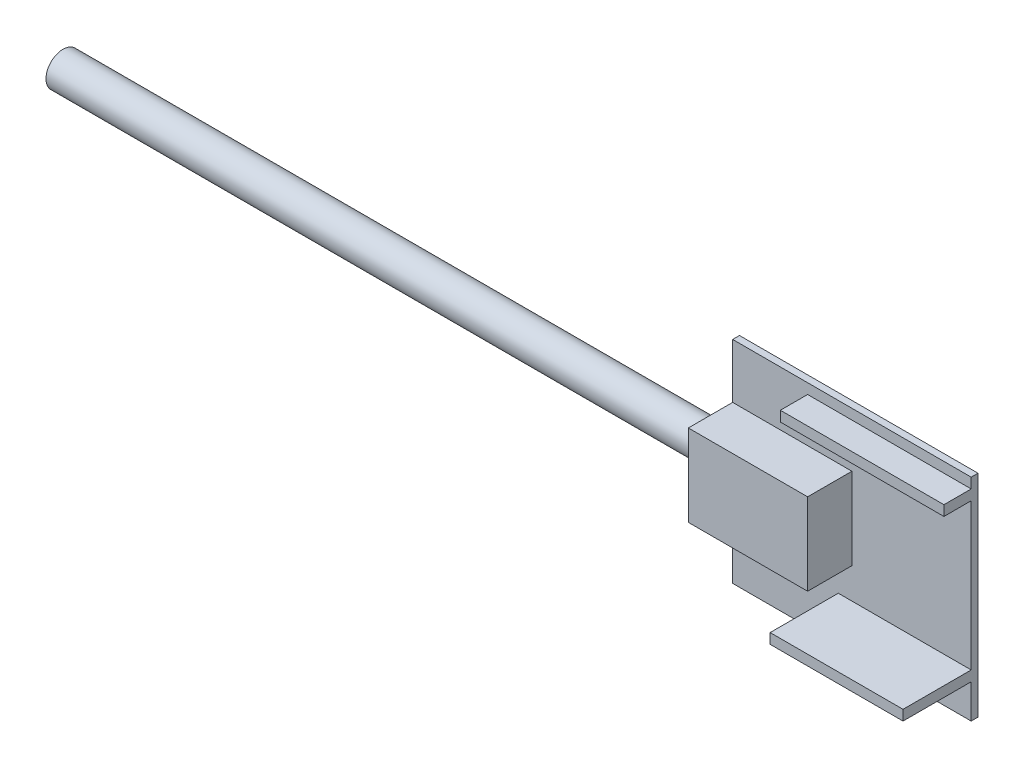
ISO-10303-21;
HEADER;
FILE_DESCRIPTION(('STEP AP214'),'2;1');
FILE_NAME('part.step','',(''),(''),'','','');
FILE_SCHEMA(('AUTOMOTIVE_DESIGN { 1 0 10303 214 1 1 1 1 }'));
ENDSEC;
DATA;
#1=APPLICATION_CONTEXT('core data for automotive mechanical design processes');
#2=APPLICATION_PROTOCOL_DEFINITION('international standard','automotive_design',2000,#1);
#3=PRODUCT_CONTEXT('',#1,'mechanical');
#4=PRODUCT('Part','Part','',(#3));
#5=PRODUCT_RELATED_PRODUCT_CATEGORY('part','',(#4));
#6=PRODUCT_DEFINITION_FORMATION('','',#4);
#7=PRODUCT_DEFINITION_CONTEXT('part definition',#1,'design');
#8=PRODUCT_DEFINITION('design','',#6,#7);
#9=PRODUCT_DEFINITION_SHAPE('','',#8);
#10=(LENGTH_UNIT() NAMED_UNIT(*) SI_UNIT(.MILLI.,.METRE.));
#11=(NAMED_UNIT(*) PLANE_ANGLE_UNIT() SI_UNIT($,.RADIAN.));
#12=(NAMED_UNIT(*) SI_UNIT($,.STERADIAN.) SOLID_ANGLE_UNIT());
#13=UNCERTAINTY_MEASURE_WITH_UNIT(LENGTH_MEASURE(1.E-05),#10,'distance_accuracy_value','');
#14=(GEOMETRIC_REPRESENTATION_CONTEXT(3) GLOBAL_UNCERTAINTY_ASSIGNED_CONTEXT((#13)) GLOBAL_UNIT_ASSIGNED_CONTEXT((#10,
#11,#12)) REPRESENTATION_CONTEXT('',''));
#15=CARTESIAN_POINT('',(0.,0.,0.));
#16=DIRECTION('',(0.,0.,1.));
#17=DIRECTION('',(1.,0.,0.));
#18=AXIS2_PLACEMENT_3D('',#15,#16,#17);
#19=CARTESIAN_POINT('',(0.,0.,2.));
#20=DIRECTION('',(0.,0.,1.));
#21=DIRECTION('',(1.,0.,0.));
#22=AXIS2_PLACEMENT_3D('',#19,#20,#21);
#23=PLANE('',#22);
#24=DIRECTION('',(0.,1.,0.));
#25=VECTOR('',#24,1.);
#26=CARTESIAN_POINT('',(35.,31.,2.));
#27=LINE('',#26,#25);
#28=CARTESIAN_POINT('',(35.,-18.,2.));
#29=VERTEX_POINT('',#28);
#30=CARTESIAN_POINT('',(35.,25.,2.));
#31=VERTEX_POINT('',#30);
#32=EDGE_CURVE('E248',#29,#31,#27,.T.);
#33=ORIENTED_EDGE('',*,*,#32,.T.);
#34=DIRECTION('',(-1.,0.,0.));
#35=VECTOR('',#34,1.);
#36=CARTESIAN_POINT('',(0.,25.,2.));
#37=LINE('',#36,#35);
#38=CARTESIAN_POINT('',(-13.,25.,2.));
#39=VERTEX_POINT('',#38);
#40=EDGE_CURVE('E174',#31,#39,#37,.T.);
#41=ORIENTED_EDGE('',*,*,#40,.T.);
#42=DIRECTION('',(0.,1.,0.));
#43=VECTOR('',#42,1.);
#44=CARTESIAN_POINT('',(-13.,0.,2.));
#45=LINE('',#44,#43);
#46=CARTESIAN_POINT('',(-13.,28.,2.));
#47=VERTEX_POINT('',#46);
#48=EDGE_CURVE('E171',#39,#47,#45,.T.);
#49=ORIENTED_EDGE('',*,*,#48,.T.);
#50=DIRECTION('',(1.,0.,0.));
#51=VECTOR('',#50,1.);
#52=CARTESIAN_POINT('',(0.,28.,2.));
#53=LINE('',#52,#51);
#54=CARTESIAN_POINT('',(35.,28.,2.));
#55=VERTEX_POINT('',#54);
#56=EDGE_CURVE('E172',#47,#55,#53,.T.);
#57=ORIENTED_EDGE('',*,*,#56,.T.);
#58=CARTESIAN_POINT('',(35.,31.,2.));
#59=VERTEX_POINT('',#58);
#60=EDGE_CURVE('E243',#55,#59,#27,.T.);
#61=ORIENTED_EDGE('',*,*,#60,.T.);
#62=DIRECTION('',(-1.,0.,0.));
#63=VECTOR('',#62,1.);
#64=CARTESIAN_POINT('',(-35.,31.,2.));
#65=LINE('',#64,#63);
#66=CARTESIAN_POINT('',(-35.,31.,2.));
#67=VERTEX_POINT('',#66);
#68=EDGE_CURVE('E247',#59,#67,#65,.T.);
#69=ORIENTED_EDGE('',*,*,#68,.T.);
#70=DIRECTION('',(0.,-1.,0.));
#71=VECTOR('',#70,1.);
#72=CARTESIAN_POINT('',(-35.,31.,2.));
#73=LINE('',#72,#71);
#74=CARTESIAN_POINT('',(-35.,15.,2.));
#75=VERTEX_POINT('',#74);
#76=EDGE_CURVE('E237',#67,#75,#73,.T.);
#77=ORIENTED_EDGE('',*,*,#76,.T.);
#78=DIRECTION('',(1.,0.,0.));
#79=VECTOR('',#78,1.);
#80=CARTESIAN_POINT('',(0.,15.,2.));
#81=LINE('',#80,#79);
#82=CARTESIAN_POINT('',(0.,15.,2.));
#83=VERTEX_POINT('',#82);
#84=EDGE_CURVE('E227',#75,#83,#81,.T.);
#85=ORIENTED_EDGE('',*,*,#84,.T.);
#86=DIRECTION('',(0.,-1.,0.));
#87=VECTOR('',#86,1.);
#88=CARTESIAN_POINT('',(0.,0.,2.));
#89=LINE('',#88,#87);
#90=CARTESIAN_POINT('',(0.,-9.,2.));
#91=VERTEX_POINT('',#90);
#92=EDGE_CURVE('E230',#83,#91,#89,.T.);
#93=ORIENTED_EDGE('',*,*,#92,.T.);
#94=DIRECTION('',(-1.,0.,0.));
#95=VECTOR('',#94,1.);
#96=CARTESIAN_POINT('',(0.,-9.,2.));
#97=LINE('',#96,#95);
#98=CARTESIAN_POINT('',(-35.,-9.,2.));
#99=VERTEX_POINT('',#98);
#100=EDGE_CURVE('E233',#91,#99,#97,.T.);
#101=ORIENTED_EDGE('',*,*,#100,.T.);
#102=CARTESIAN_POINT('',(-35.,-31.,2.));
#103=VERTEX_POINT('',#102);
#104=EDGE_CURVE('E241',#99,#103,#73,.T.);
#105=ORIENTED_EDGE('',*,*,#104,.T.);
#106=DIRECTION('',(1.,0.,0.));
#107=VECTOR('',#106,1.);
#108=CARTESIAN_POINT('',(-35.,-31.,2.));
#109=LINE('',#108,#107);
#110=CARTESIAN_POINT('',(35.,-31.,2.));
#111=VERTEX_POINT('',#110);
#112=EDGE_CURVE('E240',#103,#111,#109,.T.);
#113=ORIENTED_EDGE('',*,*,#112,.T.);
#114=CARTESIAN_POINT('',(35.,-21.,2.));
#115=VERTEX_POINT('',#114);
#116=EDGE_CURVE('E244',#111,#115,#27,.T.);
#117=ORIENTED_EDGE('',*,*,#116,.T.);
#118=DIRECTION('',(-1.,0.,0.));
#119=VECTOR('',#118,1.);
#120=CARTESIAN_POINT('',(0.,-21.,2.));
#121=LINE('',#120,#119);
#122=CARTESIAN_POINT('',(-3.99999999999997,-21.,2.));
#123=VERTEX_POINT('',#122);
#124=EDGE_CURVE('E202',#115,#123,#121,.T.);
#125=ORIENTED_EDGE('',*,*,#124,.T.);
#126=DIRECTION('',(0.,1.,0.));
#127=VECTOR('',#126,1.);
#128=CARTESIAN_POINT('',(-4.00000000000002,0.,2.));
#129=LINE('',#128,#127);
#130=CARTESIAN_POINT('',(-3.99999999999998,-18.,2.));
#131=VERTEX_POINT('',#130);
#132=EDGE_CURVE('E205',#123,#131,#129,.T.);
#133=ORIENTED_EDGE('',*,*,#132,.T.);
#134=DIRECTION('',(1.,0.,0.));
#135=VECTOR('',#134,1.);
#136=CARTESIAN_POINT('',(0.,-18.,2.));
#137=LINE('',#136,#135);
#138=EDGE_CURVE('E200',#131,#29,#137,.T.);
#139=ORIENTED_EDGE('',*,*,#138,.T.);
#140=EDGE_LOOP('',(#33,#41,#49,#57,#61,#69,#77,#85,#93,#101,#105,#113,#117,#125,#133,#139));
#141=FACE_BOUND('',#140,.T.);
#142=ADVANCED_FACE('F33',(#141),#23,.T.);
#143=CARTESIAN_POINT('',(-35.,31.,2.));
#144=DIRECTION('',(1.,0.,0.));
#145=DIRECTION('',(0.,1.,0.));
#146=AXIS2_PLACEMENT_3D('',#143,#144,#145);
#147=PLANE('',#146);
#148=CARTESIAN_POINT('',(-35.,8.,8.5));
#149=DIRECTION('',(1.,0.,0.));
#150=DIRECTION('',(0.,1.,0.));
#151=AXIS2_PLACEMENT_3D('',#148,#149,#150);
#152=CIRCLE('',#151,5.);
#153=CARTESIAN_POINT('',(-35.,13.,8.5));
#154=VERTEX_POINT('',#153);
#155=EDGE_CURVE('E11',#154,#154,#152,.F.);
#156=ORIENTED_EDGE('',*,*,#155,.F.);
#157=EDGE_LOOP('',(#156));
#158=FACE_BOUND('',#157,.T.);
#159=DIRECTION('',(0.,-1.,0.));
#160=VECTOR('',#159,1.);
#161=CARTESIAN_POINT('',(-35.,31.,0.));
#162=LINE('',#161,#160);
#163=CARTESIAN_POINT('',(-35.,31.,0.));
#164=VERTEX_POINT('',#163);
#165=CARTESIAN_POINT('',(-35.,-31.,0.));
#166=VERTEX_POINT('',#165);
#167=EDGE_CURVE('E236',#164,#166,#162,.T.);
#168=ORIENTED_EDGE('',*,*,#167,.T.);
#169=DIRECTION('',(0.,0.,-1.));
#170=VECTOR('',#169,1.);
#171=CARTESIAN_POINT('',(-35.,-31.,2.));
#172=LINE('',#171,#170);
#173=EDGE_CURVE('E41',#103,#166,#172,.T.);
#174=ORIENTED_EDGE('',*,*,#173,.F.);
#175=ORIENTED_EDGE('',*,*,#104,.F.);
#176=DIRECTION('',(0.,0.,-1.));
#177=VECTOR('',#176,1.);
#178=CARTESIAN_POINT('',(-35.,-9.,15.));
#179=LINE('',#178,#177);
#180=CARTESIAN_POINT('',(-35.,-9.,15.));
#181=VERTEX_POINT('',#180);
#182=EDGE_CURVE('E225',#181,#99,#179,.T.);
#183=ORIENTED_EDGE('',*,*,#182,.F.);
#184=DIRECTION('',(0.,-1.,0.));
#185=VECTOR('',#184,1.);
#186=CARTESIAN_POINT('',(-35.,15.,15.));
#187=LINE('',#186,#185);
#188=CARTESIAN_POINT('',(-35.,15.,15.));
#189=VERTEX_POINT('',#188);
#190=EDGE_CURVE('E208',#189,#181,#187,.T.);
#191=ORIENTED_EDGE('',*,*,#190,.F.);
#192=DIRECTION('',(0.,0.,-1.));
#193=VECTOR('',#192,1.);
#194=CARTESIAN_POINT('',(-35.,15.,15.));
#195=LINE('',#194,#193);
#196=EDGE_CURVE('E217',#189,#75,#195,.T.);
#197=ORIENTED_EDGE('',*,*,#196,.T.);
#198=ORIENTED_EDGE('',*,*,#76,.F.);
#199=DIRECTION('',(0.,0.,-1.));
#200=VECTOR('',#199,1.);
#201=CARTESIAN_POINT('',(-35.,31.,2.));
#202=LINE('',#201,#200);
#203=EDGE_CURVE('E250',#67,#164,#202,.T.);
#204=ORIENTED_EDGE('',*,*,#203,.T.);
#205=EDGE_LOOP('',(#168,#174,#175,#183,#191,#197,#198,#204));
#206=FACE_BOUND('',#205,.T.);
#207=ADVANCED_FACE('F35',(#158,#206),#147,.F.);
#208=CARTESIAN_POINT('',(-35.,-31.,2.));
#209=DIRECTION('',(0.,1.,0.));
#210=DIRECTION('',(-1.,0.,0.));
#211=AXIS2_PLACEMENT_3D('',#208,#209,#210);
#212=PLANE('',#211);
#213=DIRECTION('',(1.,0.,0.));
#214=VECTOR('',#213,1.);
#215=CARTESIAN_POINT('',(-35.,-31.,0.));
#216=LINE('',#215,#214);
#217=CARTESIAN_POINT('',(35.,-31.,0.));
#218=VERTEX_POINT('',#217);
#219=EDGE_CURVE('E252',#166,#218,#216,.T.);
#220=ORIENTED_EDGE('',*,*,#219,.T.);
#221=DIRECTION('',(0.,0.,-1.));
#222=VECTOR('',#221,1.);
#223=CARTESIAN_POINT('',(35.,-31.,2.));
#224=LINE('',#223,#222);
#225=EDGE_CURVE('E263',#111,#218,#224,.T.);
#226=ORIENTED_EDGE('',*,*,#225,.F.);
#227=ORIENTED_EDGE('',*,*,#112,.F.);
#228=ORIENTED_EDGE('',*,*,#173,.T.);
#229=EDGE_LOOP('',(#220,#226,#227,#228));
#230=FACE_BOUND('',#229,.T.);
#231=ADVANCED_FACE('F269',(#230),#212,.F.);
#232=CARTESIAN_POINT('',(35.,31.,2.));
#233=DIRECTION('',(-1.,0.,0.));
#234=DIRECTION('',(0.,-1.,0.));
#235=AXIS2_PLACEMENT_3D('',#232,#233,#234);
#236=PLANE('',#235);
#237=ORIENTED_EDGE('',*,*,#60,.F.);
#238=DIRECTION('',(0.,0.,-1.));
#239=VECTOR('',#238,1.);
#240=CARTESIAN_POINT('',(35.,28.,10.));
#241=LINE('',#240,#239);
#242=CARTESIAN_POINT('',(35.,28.,10.));
#243=VERTEX_POINT('',#242);
#244=EDGE_CURVE('E48',#243,#55,#241,.T.);
#245=ORIENTED_EDGE('',*,*,#244,.F.);
#246=DIRECTION('',(0.,1.,0.));
#247=VECTOR('',#246,1.);
#248=CARTESIAN_POINT('',(35.,28.,10.));
#249=LINE('',#248,#247);
#250=CARTESIAN_POINT('',(35.,25.,10.));
#251=VERTEX_POINT('',#250);
#252=EDGE_CURVE('E158',#251,#243,#249,.T.);
#253=ORIENTED_EDGE('',*,*,#252,.F.);
#254=DIRECTION('',(0.,0.,-1.));
#255=VECTOR('',#254,1.);
#256=CARTESIAN_POINT('',(35.,25.,10.));
#257=LINE('',#256,#255);
#258=EDGE_CURVE('E155',#251,#31,#257,.T.);
#259=ORIENTED_EDGE('',*,*,#258,.T.);
#260=ORIENTED_EDGE('',*,*,#32,.F.);
#261=DIRECTION('',(0.,0.,-1.));
#262=VECTOR('',#261,1.);
#263=CARTESIAN_POINT('',(35.,-18.,22.));
#264=LINE('',#263,#262);
#265=CARTESIAN_POINT('',(35.,-18.,22.));
#266=VERTEX_POINT('',#265);
#267=EDGE_CURVE('E56',#266,#29,#264,.T.);
#268=ORIENTED_EDGE('',*,*,#267,.F.);
#269=DIRECTION('',(0.,1.,0.));
#270=VECTOR('',#269,1.);
#271=CARTESIAN_POINT('',(35.,-18.,22.));
#272=LINE('',#271,#270);
#273=CARTESIAN_POINT('',(35.,-21.,22.));
#274=VERTEX_POINT('',#273);
#275=EDGE_CURVE('E186',#274,#266,#272,.T.);
#276=ORIENTED_EDGE('',*,*,#275,.F.);
#277=DIRECTION('',(0.,0.,-1.));
#278=VECTOR('',#277,1.);
#279=CARTESIAN_POINT('',(35.,-21.,22.));
#280=LINE('',#279,#278);
#281=EDGE_CURVE('E194',#274,#115,#280,.T.);
#282=ORIENTED_EDGE('',*,*,#281,.T.);
#283=ORIENTED_EDGE('',*,*,#116,.F.);
#284=ORIENTED_EDGE('',*,*,#225,.T.);
#285=DIRECTION('',(0.,1.,0.));
#286=VECTOR('',#285,1.);
#287=CARTESIAN_POINT('',(35.,31.,0.));
#288=LINE('',#287,#286);
#289=CARTESIAN_POINT('',(35.,31.,0.));
#290=VERTEX_POINT('',#289);
#291=EDGE_CURVE('E254',#218,#290,#288,.T.);
#292=ORIENTED_EDGE('',*,*,#291,.T.);
#293=DIRECTION('',(0.,0.,-1.));
#294=VECTOR('',#293,1.);
#295=CARTESIAN_POINT('',(35.,31.,2.));
#296=LINE('',#295,#294);
#297=EDGE_CURVE('E260',#59,#290,#296,.T.);
#298=ORIENTED_EDGE('',*,*,#297,.F.);
#299=EDGE_LOOP('',(#237,#245,#253,#259,#260,#268,#276,#282,#283,#284,#292,#298));
#300=FACE_BOUND('',#299,.T.);
#301=ADVANCED_FACE('F285',(#300),#236,.F.);
#302=CARTESIAN_POINT('',(-35.,31.,2.));
#303=DIRECTION('',(0.,-1.,0.));
#304=DIRECTION('',(0.,0.,-1.));
#305=AXIS2_PLACEMENT_3D('',#302,#303,#304);
#306=PLANE('',#305);
#307=DIRECTION('',(-1.,0.,0.));
#308=VECTOR('',#307,1.);
#309=CARTESIAN_POINT('',(-35.,31.,0.));
#310=LINE('',#309,#308);
#311=EDGE_CURVE('E256',#290,#164,#310,.T.);
#312=ORIENTED_EDGE('',*,*,#311,.T.);
#313=ORIENTED_EDGE('',*,*,#203,.F.);
#314=ORIENTED_EDGE('',*,*,#68,.F.);
#315=ORIENTED_EDGE('',*,*,#297,.T.);
#316=EDGE_LOOP('',(#312,#313,#314,#315));
#317=FACE_BOUND('',#316,.T.);
#318=ADVANCED_FACE('F289',(#317),#306,.F.);
#319=CARTESIAN_POINT('',(0.,0.,0.));
#320=DIRECTION('',(0.,0.,1.));
#321=DIRECTION('',(1.,0.,0.));
#322=AXIS2_PLACEMENT_3D('',#319,#320,#321);
#323=PLANE('',#322);
#324=ORIENTED_EDGE('',*,*,#311,.F.);
#325=ORIENTED_EDGE('',*,*,#291,.F.);
#326=ORIENTED_EDGE('',*,*,#219,.F.);
#327=ORIENTED_EDGE('',*,*,#167,.F.);
#328=EDGE_LOOP('',(#324,#325,#326,#327));
#329=FACE_BOUND('',#328,.T.);
#330=ADVANCED_FACE('F281',(#329),#323,.F.);
#331=CARTESIAN_POINT('',(-35.,-9.,15.));
#332=DIRECTION('',(0.,1.,0.));
#333=DIRECTION('',(0.,0.,1.));
#334=AXIS2_PLACEMENT_3D('',#331,#332,#333);
#335=PLANE('',#334);
#336=ORIENTED_EDGE('',*,*,#100,.F.);
#337=DIRECTION('',(0.,0.,-1.));
#338=VECTOR('',#337,1.);
#339=CARTESIAN_POINT('',(0.,-9.,15.));
#340=LINE('',#339,#338);
#341=CARTESIAN_POINT('',(0.,-9.,15.));
#342=VERTEX_POINT('',#341);
#343=EDGE_CURVE('E222',#342,#91,#340,.T.);
#344=ORIENTED_EDGE('',*,*,#343,.F.);
#345=DIRECTION('',(1.,0.,0.));
#346=VECTOR('',#345,1.);
#347=CARTESIAN_POINT('',(-35.,-9.,15.));
#348=LINE('',#347,#346);
#349=EDGE_CURVE('E211',#181,#342,#348,.T.);
#350=ORIENTED_EDGE('',*,*,#349,.F.);
#351=ORIENTED_EDGE('',*,*,#182,.T.);
#352=EDGE_LOOP('',(#336,#344,#350,#351));
#353=FACE_BOUND('',#352,.T.);
#354=ADVANCED_FACE('F316',(#353),#335,.F.);
#355=CARTESIAN_POINT('',(0.,15.,15.));
#356=DIRECTION('',(-1.,0.,0.));
#357=DIRECTION('',(0.,0.,1.));
#358=AXIS2_PLACEMENT_3D('',#355,#356,#357);
#359=PLANE('',#358);
#360=ORIENTED_EDGE('',*,*,#92,.F.);
#361=DIRECTION('',(0.,0.,-1.));
#362=VECTOR('',#361,1.);
#363=CARTESIAN_POINT('',(0.,15.,15.));
#364=LINE('',#363,#362);
#365=CARTESIAN_POINT('',(0.,15.,15.));
#366=VERTEX_POINT('',#365);
#367=EDGE_CURVE('E220',#366,#83,#364,.T.);
#368=ORIENTED_EDGE('',*,*,#367,.F.);
#369=DIRECTION('',(0.,1.,0.));
#370=VECTOR('',#369,1.);
#371=CARTESIAN_POINT('',(0.,15.,15.));
#372=LINE('',#371,#370);
#373=EDGE_CURVE('E213',#342,#366,#372,.T.);
#374=ORIENTED_EDGE('',*,*,#373,.F.);
#375=ORIENTED_EDGE('',*,*,#343,.T.);
#376=EDGE_LOOP('',(#360,#368,#374,#375));
#377=FACE_BOUND('',#376,.T.);
#378=ADVANCED_FACE('F347',(#377),#359,.F.);
#379=CARTESIAN_POINT('',(-35.,15.,15.));
#380=DIRECTION('',(0.,-1.,0.));
#381=DIRECTION('',(0.,0.,-1.));
#382=AXIS2_PLACEMENT_3D('',#379,#380,#381);
#383=PLANE('',#382);
#384=ORIENTED_EDGE('',*,*,#84,.F.);
#385=ORIENTED_EDGE('',*,*,#196,.F.);
#386=DIRECTION('',(-1.,0.,0.));
#387=VECTOR('',#386,1.);
#388=CARTESIAN_POINT('',(-35.,15.,15.));
#389=LINE('',#388,#387);
#390=EDGE_CURVE('E215',#366,#189,#389,.T.);
#391=ORIENTED_EDGE('',*,*,#390,.F.);
#392=ORIENTED_EDGE('',*,*,#367,.T.);
#393=EDGE_LOOP('',(#384,#385,#391,#392));
#394=FACE_BOUND('',#393,.T.);
#395=ADVANCED_FACE('F354',(#394),#383,.F.);
#396=CARTESIAN_POINT('',(0.,0.,15.));
#397=DIRECTION('',(0.,0.,1.));
#398=DIRECTION('',(1.,0.,0.));
#399=AXIS2_PLACEMENT_3D('',#396,#397,#398);
#400=PLANE('',#399);
#401=ORIENTED_EDGE('',*,*,#190,.T.);
#402=ORIENTED_EDGE('',*,*,#349,.T.);
#403=ORIENTED_EDGE('',*,*,#373,.T.);
#404=ORIENTED_EDGE('',*,*,#390,.T.);
#405=EDGE_LOOP('',(#401,#402,#403,#404));
#406=FACE_BOUND('',#405,.T.);
#407=ADVANCED_FACE('F361',(#406),#400,.T.);
#408=CARTESIAN_POINT('',(-3.99999999999998,-18.,22.));
#409=DIRECTION('',(1.,0.,0.));
#410=DIRECTION('',(0.,1.,0.));
#411=AXIS2_PLACEMENT_3D('',#408,#409,#410);
#412=PLANE('',#411);
#413=ORIENTED_EDGE('',*,*,#132,.F.);
#414=DIRECTION('',(0.,0.,-1.));
#415=VECTOR('',#414,1.);
#416=CARTESIAN_POINT('',(-3.99999999999997,-21.,22.));
#417=LINE('',#416,#415);
#418=CARTESIAN_POINT('',(-3.99999999999997,-21.,22.));
#419=VERTEX_POINT('',#418);
#420=EDGE_CURVE('E197',#419,#123,#417,.T.);
#421=ORIENTED_EDGE('',*,*,#420,.F.);
#422=DIRECTION('',(0.,-1.,0.));
#423=VECTOR('',#422,1.);
#424=CARTESIAN_POINT('',(-3.99999999999998,-18.,22.));
#425=LINE('',#424,#423);
#426=CARTESIAN_POINT('',(-3.99999999999998,-18.,22.));
#427=VERTEX_POINT('',#426);
#428=EDGE_CURVE('E181',#427,#419,#425,.T.);
#429=ORIENTED_EDGE('',*,*,#428,.F.);
#430=DIRECTION('',(0.,0.,-1.));
#431=VECTOR('',#430,1.);
#432=CARTESIAN_POINT('',(-3.99999999999998,-18.,22.));
#433=LINE('',#432,#431);
#434=EDGE_CURVE('E190',#427,#131,#433,.T.);
#435=ORIENTED_EDGE('',*,*,#434,.T.);
#436=EDGE_LOOP('',(#413,#421,#429,#435));
#437=FACE_BOUND('',#436,.T.);
#438=ADVANCED_FACE('F369',(#437),#412,.F.);
#439=CARTESIAN_POINT('',(-3.99999999999997,-21.,22.));
#440=DIRECTION('',(0.,1.,0.));
#441=DIRECTION('',(0.,0.,1.));
#442=AXIS2_PLACEMENT_3D('',#439,#440,#441);
#443=PLANE('',#442);
#444=ORIENTED_EDGE('',*,*,#124,.F.);
#445=ORIENTED_EDGE('',*,*,#281,.F.);
#446=DIRECTION('',(1.,0.,0.));
#447=VECTOR('',#446,1.);
#448=CARTESIAN_POINT('',(-3.99999999999997,-21.,22.));
#449=LINE('',#448,#447);
#450=EDGE_CURVE('E184',#419,#274,#449,.T.);
#451=ORIENTED_EDGE('',*,*,#450,.F.);
#452=ORIENTED_EDGE('',*,*,#420,.T.);
#453=EDGE_LOOP('',(#444,#445,#451,#452));
#454=FACE_BOUND('',#453,.T.);
#455=ADVANCED_FACE('F377',(#454),#443,.F.);
#456=CARTESIAN_POINT('',(-3.99999999999998,-18.,22.));
#457=DIRECTION('',(0.,-1.,0.));
#458=DIRECTION('',(0.,0.,-1.));
#459=AXIS2_PLACEMENT_3D('',#456,#457,#458);
#460=PLANE('',#459);
#461=ORIENTED_EDGE('',*,*,#138,.F.);
#462=ORIENTED_EDGE('',*,*,#434,.F.);
#463=DIRECTION('',(-1.,0.,0.));
#464=VECTOR('',#463,1.);
#465=CARTESIAN_POINT('',(-3.99999999999998,-18.,22.));
#466=LINE('',#465,#464);
#467=EDGE_CURVE('E188',#266,#427,#466,.T.);
#468=ORIENTED_EDGE('',*,*,#467,.F.);
#469=ORIENTED_EDGE('',*,*,#267,.T.);
#470=EDGE_LOOP('',(#461,#462,#468,#469));
#471=FACE_BOUND('',#470,.T.);
#472=ADVANCED_FACE('F385',(#471),#460,.F.);
#473=CARTESIAN_POINT('',(0.,0.,22.));
#474=DIRECTION('',(0.,0.,1.));
#475=DIRECTION('',(1.,0.,0.));
#476=AXIS2_PLACEMENT_3D('',#473,#474,#475);
#477=PLANE('',#476);
#478=ORIENTED_EDGE('',*,*,#428,.T.);
#479=ORIENTED_EDGE('',*,*,#450,.T.);
#480=ORIENTED_EDGE('',*,*,#275,.T.);
#481=ORIENTED_EDGE('',*,*,#467,.T.);
#482=EDGE_LOOP('',(#478,#479,#480,#481));
#483=FACE_BOUND('',#482,.T.);
#484=ADVANCED_FACE('F393',(#483),#477,.T.);
#485=CARTESIAN_POINT('',(-13.,28.,10.));
#486=DIRECTION('',(1.,0.,0.));
#487=DIRECTION('',(0.,1.,0.));
#488=AXIS2_PLACEMENT_3D('',#485,#486,#487);
#489=PLANE('',#488);
#490=ORIENTED_EDGE('',*,*,#48,.F.);
#491=DIRECTION('',(0.,0.,-1.));
#492=VECTOR('',#491,1.);
#493=CARTESIAN_POINT('',(-13.,25.,10.));
#494=LINE('',#493,#492);
#495=CARTESIAN_POINT('',(-13.,25.,10.));
#496=VERTEX_POINT('',#495);
#497=EDGE_CURVE('E152',#496,#39,#494,.T.);
#498=ORIENTED_EDGE('',*,*,#497,.F.);
#499=DIRECTION('',(0.,-1.,0.));
#500=VECTOR('',#499,1.);
#501=CARTESIAN_POINT('',(-13.,28.,10.));
#502=LINE('',#501,#500);
#503=CARTESIAN_POINT('',(-13.,28.,10.));
#504=VERTEX_POINT('',#503);
#505=EDGE_CURVE('E159',#504,#496,#502,.T.);
#506=ORIENTED_EDGE('',*,*,#505,.F.);
#507=DIRECTION('',(0.,0.,-1.));
#508=VECTOR('',#507,1.);
#509=CARTESIAN_POINT('',(-13.,28.,10.));
#510=LINE('',#509,#508);
#511=EDGE_CURVE('E295',#504,#47,#510,.T.);
#512=ORIENTED_EDGE('',*,*,#511,.T.);
#513=EDGE_LOOP('',(#490,#498,#506,#512));
#514=FACE_BOUND('',#513,.T.);
#515=ADVANCED_FACE('F169',(#514),#489,.F.);
#516=CARTESIAN_POINT('',(-13.,25.,10.));
#517=DIRECTION('',(0.,1.,0.));
#518=DIRECTION('',(0.,0.,1.));
#519=AXIS2_PLACEMENT_3D('',#516,#517,#518);
#520=PLANE('',#519);
#521=ORIENTED_EDGE('',*,*,#40,.F.);
#522=ORIENTED_EDGE('',*,*,#258,.F.);
#523=DIRECTION('',(1.,0.,0.));
#524=VECTOR('',#523,1.);
#525=CARTESIAN_POINT('',(-13.,25.,10.));
#526=LINE('',#525,#524);
#527=EDGE_CURVE('E148',#496,#251,#526,.T.);
#528=ORIENTED_EDGE('',*,*,#527,.F.);
#529=ORIENTED_EDGE('',*,*,#497,.T.);
#530=EDGE_LOOP('',(#521,#522,#528,#529));
#531=FACE_BOUND('',#530,.T.);
#532=ADVANCED_FACE('F150',(#531),#520,.F.);
#533=CARTESIAN_POINT('',(-13.,28.,10.));
#534=DIRECTION('',(0.,-1.,0.));
#535=DIRECTION('',(0.,0.,-1.));
#536=AXIS2_PLACEMENT_3D('',#533,#534,#535);
#537=PLANE('',#536);
#538=ORIENTED_EDGE('',*,*,#56,.F.);
#539=ORIENTED_EDGE('',*,*,#511,.F.);
#540=DIRECTION('',(-1.,0.,0.));
#541=VECTOR('',#540,1.);
#542=CARTESIAN_POINT('',(-13.,28.,10.));
#543=LINE('',#542,#541);
#544=EDGE_CURVE('E163',#243,#504,#543,.T.);
#545=ORIENTED_EDGE('',*,*,#544,.F.);
#546=ORIENTED_EDGE('',*,*,#244,.T.);
#547=EDGE_LOOP('',(#538,#539,#545,#546));
#548=FACE_BOUND('',#547,.T.);
#549=ADVANCED_FACE('F298',(#548),#537,.F.);
#550=CARTESIAN_POINT('',(0.,0.,10.));
#551=DIRECTION('',(0.,0.,1.));
#552=DIRECTION('',(1.,0.,0.));
#553=AXIS2_PLACEMENT_3D('',#550,#551,#552);
#554=PLANE('',#553);
#555=ORIENTED_EDGE('',*,*,#505,.T.);
#556=ORIENTED_EDGE('',*,*,#527,.T.);
#557=ORIENTED_EDGE('',*,*,#252,.T.);
#558=ORIENTED_EDGE('',*,*,#544,.T.);
#559=EDGE_LOOP('',(#555,#556,#557,#558));
#560=FACE_BOUND('',#559,.T.);
#561=ADVANCED_FACE('F162',(#560),#554,.T.);
#562=CARTESIAN_POINT('',(-225.,7.99999999999998,8.5));
#563=DIRECTION('',(1.,0.,0.));
#564=DIRECTION('',(0.,1.,0.));
#565=AXIS2_PLACEMENT_3D('',#562,#563,#564);
#566=CYLINDRICAL_SURFACE('',#565,5.);
#567=CARTESIAN_POINT('',(-225.,7.99999999999998,8.5));
#568=DIRECTION('',(-1.,0.,0.));
#569=DIRECTION('',(0.,-1.,0.));
#570=AXIS2_PLACEMENT_3D('',#567,#568,#569);
#571=CIRCLE('',#570,5.);
#572=CARTESIAN_POINT('',(-225.,2.99999999999998,8.5));
#573=VERTEX_POINT('',#572);
#574=EDGE_CURVE('E167',#573,#573,#571,.T.);
#575=ORIENTED_EDGE('',*,*,#574,.F.);
#576=EDGE_LOOP('',(#575));
#577=FACE_BOUND('',#576,.T.);
#578=ORIENTED_EDGE('',*,*,#155,.T.);
#579=EDGE_LOOP('',(#578));
#580=FACE_BOUND('',#579,.T.);
#581=ADVANCED_FACE('F305',(#577,#580),#566,.T.);
#582=CARTESIAN_POINT('',(-225.,7.99999999999998,8.5));
#583=DIRECTION('',(-1.,0.,0.));
#584=DIRECTION('',(0.,-1.,0.));
#585=AXIS2_PLACEMENT_3D('',#582,#583,#584);
#586=PLANE('',#585);
#587=ORIENTED_EDGE('',*,*,#574,.T.);
#588=EDGE_LOOP('',(#587));
#589=FACE_BOUND('',#588,.T.);
#590=ADVANCED_FACE('F434',(#589),#586,.T.);
#591=CLOSED_SHELL('',(#142,#207,#231,#301,#318,#330,#354,#378,#395,#407,#438,#455,#472,#484,
#515,#532,#549,#561,#581,#590));
#592=MANIFOLD_SOLID_BREP('B2',#591);
#593=ADVANCED_BREP_SHAPE_REPRESENTATION('',(#18,#592),#14);
#594=SHAPE_DEFINITION_REPRESENTATION(#9,#593);
ENDSEC;
END-ISO-10303-21;
